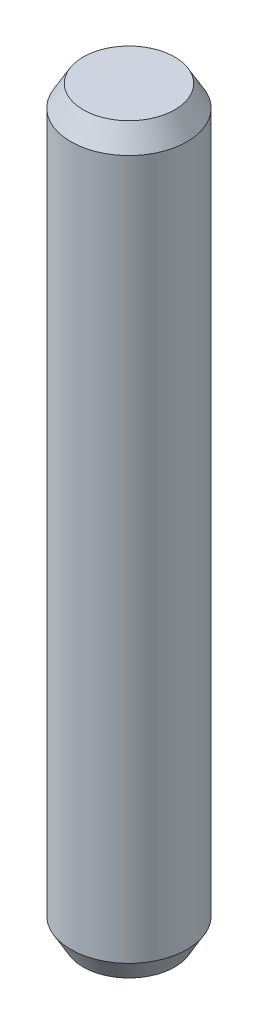
ISO-10303-21;
HEADER;
FILE_DESCRIPTION(('STEP AP214'),'2;1');
FILE_NAME('part.step','',(''),(''),'','','');
FILE_SCHEMA(('AUTOMOTIVE_DESIGN { 1 0 10303 214 1 1 1 1 }'));
ENDSEC;
DATA;
#1=APPLICATION_CONTEXT('core data for automotive mechanical design processes');
#2=APPLICATION_PROTOCOL_DEFINITION('international standard','automotive_design',2000,#1);
#3=PRODUCT_CONTEXT('',#1,'mechanical');
#4=PRODUCT('Part','Part','',(#3));
#5=PRODUCT_RELATED_PRODUCT_CATEGORY('part','',(#4));
#6=PRODUCT_DEFINITION_FORMATION('','',#4);
#7=PRODUCT_DEFINITION_CONTEXT('part definition',#1,'design');
#8=PRODUCT_DEFINITION('design','',#6,#7);
#9=PRODUCT_DEFINITION_SHAPE('','',#8);
#10=(LENGTH_UNIT() NAMED_UNIT(*) SI_UNIT(.MILLI.,.METRE.));
#11=(NAMED_UNIT(*) PLANE_ANGLE_UNIT() SI_UNIT($,.RADIAN.));
#12=(NAMED_UNIT(*) SI_UNIT($,.STERADIAN.) SOLID_ANGLE_UNIT());
#13=UNCERTAINTY_MEASURE_WITH_UNIT(LENGTH_MEASURE(1.E-05),#10,'distance_accuracy_value','');
#14=(GEOMETRIC_REPRESENTATION_CONTEXT(3) GLOBAL_UNCERTAINTY_ASSIGNED_CONTEXT((#13)) GLOBAL_UNIT_ASSIGNED_CONTEXT((#10,
#11,#12)) REPRESENTATION_CONTEXT('',''));
#15=CARTESIAN_POINT('',(0.,0.,0.));
#16=DIRECTION('',(0.,0.,1.));
#17=DIRECTION('',(1.,0.,0.));
#18=AXIS2_PLACEMENT_3D('',#15,#16,#17);
#19=CARTESIAN_POINT('',(0.,60.,0.));
#20=DIRECTION('',(0.,-1.,0.));
#21=DIRECTION('',(0.,0.,-1.));
#22=AXIS2_PLACEMENT_3D('',#19,#20,#21);
#23=CYLINDRICAL_SURFACE('',#22,4.7);
#24=CARTESIAN_POINT('',(0.,58.2679491924311,0.));
#25=DIRECTION('',(0.,1.,0.));
#26=DIRECTION('',(0.,0.,1.));
#27=AXIS2_PLACEMENT_3D('',#24,#25,#26);
#28=CIRCLE('',#27,4.7);
#29=CARTESIAN_POINT('',(0.,58.2679491924311,4.7));
#30=VERTEX_POINT('',#29);
#31=EDGE_CURVE('E10',#30,#30,#28,.F.);
#32=ORIENTED_EDGE('',*,*,#31,.T.);
#33=EDGE_LOOP('',(#32));
#34=FACE_BOUND('',#33,.T.);
#35=CARTESIAN_POINT('',(0.,1.73205080756889,0.));
#36=DIRECTION('',(0.,1.,0.));
#37=DIRECTION('',(0.,0.,1.));
#38=AXIS2_PLACEMENT_3D('',#35,#36,#37);
#39=CIRCLE('',#38,4.7);
#40=CARTESIAN_POINT('',(0.,1.73205080756889,4.7));
#41=VERTEX_POINT('',#40);
#42=EDGE_CURVE('E62',#41,#41,#39,.T.);
#43=ORIENTED_EDGE('',*,*,#42,.T.);
#44=EDGE_LOOP('',(#43));
#45=FACE_BOUND('',#44,.T.);
#46=ADVANCED_FACE('F43',(#34,#45),#23,.T.);
#47=CARTESIAN_POINT('',(0.,60.,0.));
#48=DIRECTION('',(0.,1.,0.));
#49=DIRECTION('',(0.,0.,1.));
#50=AXIS2_PLACEMENT_3D('',#47,#48,#49);
#51=PLANE('',#50);
#52=CARTESIAN_POINT('',(0.,60.,0.));
#53=DIRECTION('',(0.,1.,0.));
#54=DIRECTION('',(0.,0.,1.));
#55=AXIS2_PLACEMENT_3D('',#52,#53,#54);
#56=CIRCLE('',#55,3.70000000000001);
#57=CARTESIAN_POINT('',(0.,60.,3.70000000000001));
#58=VERTEX_POINT('',#57);
#59=EDGE_CURVE('E52',#58,#58,#56,.T.);
#60=ORIENTED_EDGE('',*,*,#59,.T.);
#61=EDGE_LOOP('',(#60));
#62=FACE_BOUND('',#61,.T.);
#63=ADVANCED_FACE('F79',(#62),#51,.T.);
#64=CARTESIAN_POINT('',(0.,0.,0.));
#65=DIRECTION('',(0.,1.,0.));
#66=DIRECTION('',(0.,0.,1.));
#67=AXIS2_PLACEMENT_3D('',#64,#65,#66);
#68=PLANE('',#67);
#69=CARTESIAN_POINT('',(0.,0.,0.));
#70=DIRECTION('',(0.,1.,0.));
#71=DIRECTION('',(0.,0.,1.));
#72=AXIS2_PLACEMENT_3D('',#69,#70,#71);
#73=CIRCLE('',#72,3.69999999999999);
#74=CARTESIAN_POINT('',(0.,0.,3.69999999999999));
#75=VERTEX_POINT('',#74);
#76=EDGE_CURVE('E57',#75,#75,#73,.F.);
#77=ORIENTED_EDGE('',*,*,#76,.T.);
#78=EDGE_LOOP('',(#77));
#79=FACE_BOUND('',#78,.T.);
#80=ADVANCED_FACE('F72',(#79),#68,.F.);
#81=CARTESIAN_POINT('',(0.,1.73205080756889,0.));
#82=DIRECTION('',(0.,1.,0.));
#83=DIRECTION('',(0.,0.,1.));
#84=AXIS2_PLACEMENT_3D('',#81,#82,#83);
#85=CONICAL_SURFACE('',#84,4.7,0.523598775598299);
#86=ORIENTED_EDGE('',*,*,#76,.F.);
#87=EDGE_LOOP('',(#86));
#88=FACE_BOUND('',#87,.T.);
#89=ORIENTED_EDGE('',*,*,#42,.F.);
#90=EDGE_LOOP('',(#89));
#91=FACE_BOUND('',#90,.T.);
#92=ADVANCED_FACE('F70',(#88,#91),#85,.T.);
#93=CARTESIAN_POINT('',(0.,60.,0.));
#94=DIRECTION('',(0.,-1.,0.));
#95=DIRECTION('',(0.,0.,-1.));
#96=AXIS2_PLACEMENT_3D('',#93,#94,#95);
#97=CONICAL_SURFACE('',#96,3.70000000000001,0.5235987755983);
#98=ORIENTED_EDGE('',*,*,#31,.F.);
#99=EDGE_LOOP('',(#98));
#100=FACE_BOUND('',#99,.T.);
#101=ORIENTED_EDGE('',*,*,#59,.F.);
#102=EDGE_LOOP('',(#101));
#103=FACE_BOUND('',#102,.T.);
#104=ADVANCED_FACE('F46',(#100,#103),#97,.T.);
#105=CLOSED_SHELL('',(#46,#63,#80,#92,#104));
#106=MANIFOLD_SOLID_BREP('B2',#105);
#107=ADVANCED_BREP_SHAPE_REPRESENTATION('',(#18,#106),#14);
#108=SHAPE_DEFINITION_REPRESENTATION(#9,#107);
ENDSEC;
END-ISO-10303-21;
